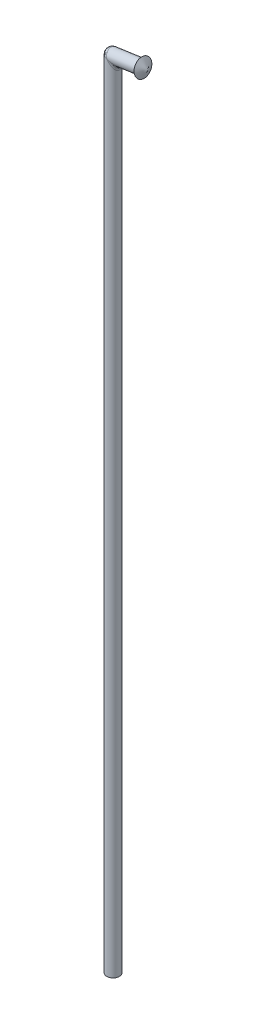
ISO-10303-21;
HEADER;
FILE_DESCRIPTION(('STEP AP214'),'2;1');
FILE_NAME('part.step','',(''),(''),'','','');
FILE_SCHEMA(('AUTOMOTIVE_DESIGN { 1 0 10303 214 1 1 1 1 }'));
ENDSEC;
DATA;
#1=APPLICATION_CONTEXT('core data for automotive mechanical design processes');
#2=APPLICATION_PROTOCOL_DEFINITION('international standard','automotive_design',2000,#1);
#3=PRODUCT_CONTEXT('',#1,'mechanical');
#4=PRODUCT('Part','Part','',(#3));
#5=PRODUCT_RELATED_PRODUCT_CATEGORY('part','',(#4));
#6=PRODUCT_DEFINITION_FORMATION('','',#4);
#7=PRODUCT_DEFINITION_CONTEXT('part definition',#1,'design');
#8=PRODUCT_DEFINITION('design','',#6,#7);
#9=PRODUCT_DEFINITION_SHAPE('','',#8);
#10=(LENGTH_UNIT() NAMED_UNIT(*) SI_UNIT(.MILLI.,.METRE.));
#11=(NAMED_UNIT(*) PLANE_ANGLE_UNIT() SI_UNIT($,.RADIAN.));
#12=(NAMED_UNIT(*) SI_UNIT($,.STERADIAN.) SOLID_ANGLE_UNIT());
#13=UNCERTAINTY_MEASURE_WITH_UNIT(LENGTH_MEASURE(1.E-05),#10,'distance_accuracy_value','');
#14=(GEOMETRIC_REPRESENTATION_CONTEXT(3) GLOBAL_UNCERTAINTY_ASSIGNED_CONTEXT((#13)) GLOBAL_UNIT_ASSIGNED_CONTEXT((#10,
#11,#12)) REPRESENTATION_CONTEXT('',''));
#15=CARTESIAN_POINT('',(0.,0.,0.));
#16=DIRECTION('',(0.,0.,1.));
#17=DIRECTION('',(1.,0.,0.));
#18=AXIS2_PLACEMENT_3D('',#15,#16,#17);
#19=CARTESIAN_POINT('',(0.,0.,0.));
#20=DIRECTION('',(0.,1.,0.));
#21=DIRECTION('',(0.,0.,1.));
#22=AXIS2_PLACEMENT_3D('',#19,#20,#21);
#23=PLANE('',#22);
#24=CARTESIAN_POINT('',(0.,0.,0.));
#25=DIRECTION('',(0.,1.,0.));
#26=DIRECTION('',(0.,0.,1.));
#27=AXIS2_PLACEMENT_3D('',#24,#25,#26);
#28=CIRCLE('',#27,1.25);
#29=CARTESIAN_POINT('',(0.,0.,1.25));
#30=VERTEX_POINT('',#29);
#31=EDGE_CURVE('E89',#30,#30,#28,.T.);
#32=ORIENTED_EDGE('',*,*,#31,.F.);
#33=EDGE_LOOP('',(#32));
#34=FACE_BOUND('',#33,.T.);
#35=ADVANCED_FACE('F46',(#34),#23,.F.);
#36=CARTESIAN_POINT('',(-2.46200161876884,157.650043674398,0.));
#37=DIRECTION('',(0.990048234541686,0.140728438067404,0.));
#38=DIRECTION('',(-0.140728438067404,0.990048234541686,0.));
#39=AXIS2_PLACEMENT_3D('',#36,#37,#38);
#40=CYLINDRICAL_SURFACE('',#39,1.25);
#41=CARTESIAN_POINT('',(0.,158.,0.));
#42=DIRECTION('',(-0.415227467097706,-0.909717621335117,0.));
#43=DIRECTION('',(-0.909717621335117,0.415227467097706,0.));
#44=AXIS2_PLACEMENT_3D('',#41,#42,#43);
#45=ELLIPSE('',#44,2.31860031339944,1.25);
#46=CARTESIAN_POINT('',(0.,158.,1.25));
#47=VERTEX_POINT('',#46);
#48=CARTESIAN_POINT('',(0.,158.,-1.25));
#49=VERTEX_POINT('',#48);
#50=EDGE_CURVE('E59',#47,#49,#45,.F.);
#51=ORIENTED_EDGE('',*,*,#50,.T.);
#52=CARTESIAN_POINT('',(0.,158.,0.));
#53=DIRECTION('',(-0.951393670650659,-0.307977407362724,0.));
#54=DIRECTION('',(-0.307977407362724,0.951393670650659,0.));
#55=AXIS2_PLACEMENT_3D('',#52,#53,#54);
#56=ELLIPSE('',#55,1.2686918868929,1.25);
#57=EDGE_CURVE('E13',#49,#47,#56,.F.);
#58=ORIENTED_EDGE('',*,*,#57,.T.);
#59=EDGE_LOOP('',(#51,#58));
#60=FACE_BOUND('',#59,.T.);
#61=CARTESIAN_POINT('',(5.94028940725011,158.844370628404,0.));
#62=DIRECTION('',(0.990048234541686,0.140728438067404,0.));
#63=DIRECTION('',(0.,0.,1.));
#64=AXIS2_PLACEMENT_3D('',#61,#62,#63);
#65=CIRCLE('',#64,1.25);
#66=CARTESIAN_POINT('',(5.94028940725011,158.844370628404,1.25));
#67=VERTEX_POINT('',#66);
#68=EDGE_CURVE('E86',#67,#67,#65,.T.);
#69=ORIENTED_EDGE('',*,*,#68,.F.);
#70=EDGE_LOOP('',(#69));
#71=FACE_BOUND('',#70,.T.);
#72=ADVANCED_FACE('F107',(#60,#71),#40,.T.);
#73=CARTESIAN_POINT('',(0.,0.,0.));
#74=DIRECTION('',(0.,1.,0.));
#75=DIRECTION('',(0.,0.,1.));
#76=AXIS2_PLACEMENT_3D('',#73,#74,#75);
#77=CYLINDRICAL_SURFACE('',#76,1.25);
#78=ORIENTED_EDGE('',*,*,#31,.T.);
#79=EDGE_LOOP('',(#78));
#80=FACE_BOUND('',#79,.T.);
#81=CARTESIAN_POINT('',(0.,158.,0.));
#82=DIRECTION('',(-0.171024343180322,-0.985266803480021,0.));
#83=DIRECTION('',(-0.985266803480021,0.171024343180322,0.));
#84=AXIS2_PLACEMENT_3D('',#81,#82,#83);
#85=ELLIPSE('',#84,1.2686918868929,1.25);
#86=EDGE_CURVE('E93',#47,#49,#85,.T.);
#87=ORIENTED_EDGE('',*,*,#86,.T.);
#88=CARTESIAN_POINT('',(0.,158.,0.));
#89=DIRECTION('',(-0.842230012046951,-0.539118360666183,0.));
#90=DIRECTION('',(-0.539118360666183,0.842230012046951,0.));
#91=AXIS2_PLACEMENT_3D('',#88,#89,#90);
#92=ELLIPSE('',#91,2.31860031339943,1.25);
#93=EDGE_CURVE('E97',#49,#47,#92,.T.);
#94=ORIENTED_EDGE('',*,*,#93,.T.);
#95=EDGE_LOOP('',(#87,#94));
#96=FACE_BOUND('',#95,.T.);
#97=ADVANCED_FACE('F80',(#80,#96),#77,.T.);
#98=CARTESIAN_POINT('',(5.94028940725012,158.844370628404,0.));
#99=DIRECTION('',(-0.990048234541686,-0.140728438067404,0.));
#100=DIRECTION('',(-0.140728438067404,0.990048234541686,0.));
#101=AXIS2_PLACEMENT_3D('',#98,#99,#100);
#102=CONICAL_SURFACE('',#101,1.75000000000001,1.11701072127637);
#103=CARTESIAN_POINT('',(6.78532728666676,158.964486857826,0.));
#104=VERTEX_POINT('',#103);
#105=VERTEX_LOOP('',#104);
#106=FACE_BOUND('',#105,.T.);
#107=CARTESIAN_POINT('',(5.94028940725012,158.844370628404,0.));
#108=DIRECTION('',(0.990048234541686,0.140728438067404,0.));
#109=DIRECTION('',(-0.140728438067404,0.990048234541686,0.));
#110=AXIS2_PLACEMENT_3D('',#107,#108,#109);
#111=CIRCLE('',#110,1.75000000000001);
#112=CARTESIAN_POINT('',(5.69401464063216,160.576955038852,0.));
#113=VERTEX_POINT('',#112);
#114=EDGE_CURVE('E84',#113,#113,#111,.T.);
#115=ORIENTED_EDGE('',*,*,#114,.T.);
#116=EDGE_LOOP('',(#115));
#117=FACE_BOUND('',#116,.T.);
#118=ADVANCED_FACE('F76',(#106,#117),#102,.T.);
#119=CARTESIAN_POINT('',(5.94028940725012,158.844370628404,0.));
#120=DIRECTION('',(0.990048234541686,0.140728438067404,0.));
#121=DIRECTION('',(-0.140728438067404,0.990048234541686,0.));
#122=AXIS2_PLACEMENT_3D('',#119,#120,#121);
#123=PLANE('',#122);
#124=ORIENTED_EDGE('',*,*,#68,.T.);
#125=EDGE_LOOP('',(#124));
#126=FACE_BOUND('',#125,.T.);
#127=ORIENTED_EDGE('',*,*,#114,.F.);
#128=EDGE_LOOP('',(#127));
#129=FACE_BOUND('',#128,.T.);
#130=ADVANCED_FACE('F79',(#126,#129),#123,.F.);
#131=CARTESIAN_POINT('',(0.,158.,1.25));
#132=CARTESIAN_POINT('',(0.,158.,1.25));
#133=CARTESIAN_POINT('',(0.,158.,1.25));
#134=CARTESIAN_POINT('',(0.0919090780486481,157.958049428981,1.24998466260043));
#135=CARTESIAN_POINT('',(0.0732103912828929,157.936460058134,1.25012947653364));
#136=CARTESIAN_POINT('',(0.0544673097737803,157.914909217875,1.24998466260043));
#137=CARTESIAN_POINT('',(0.18384034216575,157.916088731451,1.24643859237733));
#138=CARTESIAN_POINT('',(0.146578309183977,157.872783397532,1.24398902870987));
#139=CARTESIAN_POINT('',(0.108947767492126,157.829797895561,1.24643859237732));
#140=CARTESIAN_POINT('',(0.366122526857958,157.832888661372,1.23222560778185));
#141=CARTESIAN_POINT('',(0.290621167785291,157.747767334902,1.22003105610716));
#142=CARTESIAN_POINT('',(0.216972137126396,157.661038356327,1.23222560778185));
#143=CARTESIAN_POINT('',(0.456480084233948,157.791646259552,1.22161084378618));
#144=CARTESIAN_POINT('',(0.361651202370123,157.686119743773,1.20218398658378));
#145=CARTESIAN_POINT('',(0.270519982154233,157.57738399496,1.22161084378618));
#146=CARTESIAN_POINT('',(0.634075243492491,157.710585514527,1.19340762522205));
#147=CARTESIAN_POINT('',(0.498712964638946,157.56716263599,1.15549659329999));
#148=CARTESIAN_POINT('',(0.375766719027591,157.412963773108,1.19340762522205));
#149=CARTESIAN_POINT('',(0.721339013126855,157.67075522743,1.17592147104714));
#150=CARTESIAN_POINT('',(0.56509167791778,157.509551967491,1.12659905960002));
#151=CARTESIAN_POINT('',(0.427481118449451,157.332173686133,1.17592147104714));
#152=CARTESIAN_POINT('',(0.891227594801344,157.593212038419,1.13421919213761));
#153=CARTESIAN_POINT('',(0.690692005869755,157.40054233926,1.05927281246361));
#154=CARTESIAN_POINT('',(0.528160770574727,157.17488832765,1.1342191921376));
#155=CARTESIAN_POINT('',(0.973911310051928,157.555472250986,1.1101518668742));
#156=CARTESIAN_POINT('',(0.750242294770595,157.348858120278,1.02076172267759));
#157=CARTESIAN_POINT('',(0.577160930596101,157.098338522679,1.1101518668742));
#158=CARTESIAN_POINT('',(1.13319102705518,157.482771325006,1.05565384916028));
#159=CARTESIAN_POINT('',(0.860260578706606,157.253372284961,0.936260478329249));
#160=CARTESIAN_POINT('',(0.671553539801737,156.950875007821,1.05565384916027));
#161=CARTESIAN_POINT('',(1.2098909115074,157.447762770702,1.02541153193446));
#162=CARTESIAN_POINT('',(0.911029021123789,157.209309907704,0.890169574167184));
#163=CARTESIAN_POINT('',(0.717007552123144,156.879865121796,1.02541153193446));
#164=CARTESIAN_POINT('',(1.35584272610455,157.38114517325,0.959041682376993));
#165=CARTESIAN_POINT('',(1.00197382996496,157.130378109014,0.793258137981303));
#166=CARTESIAN_POINT('',(0.803501757771693,156.744740775863,0.959041682376991));
#167=CARTESIAN_POINT('',(1.4252537537771,157.349463512333,0.923131320056256));
#168=CARTESIAN_POINT('',(1.04241045588986,157.095282806073,0.742330277428939));
#169=CARTESIAN_POINT('',(0.844636235738668,156.680479021114,0.923131320056252));
#170=CARTESIAN_POINT('',(1.55538246437086,157.290068142133,0.84601304395963));
#171=CARTESIAN_POINT('',(1.11185924589663,157.035007591006,0.639134029290798));
#172=CARTESIAN_POINT('',(0.921753327334579,156.560003938604,0.846013043959629));
#173=CARTESIAN_POINT('',(1.61631975028436,157.262254198236,0.80503527866337));
#174=CARTESIAN_POINT('',(1.14108042925682,157.009646269212,0.586769835645948));
#175=CARTESIAN_POINT('',(0.957866082451842,156.503587299149,0.805035278663372));
#176=CARTESIAN_POINT('',(1.72839589498728,157.211098660962,0.718474476155359));
#177=CARTESIAN_POINT('',(1.1882840766356,156.968677808892,0.484492894127739));
#178=CARTESIAN_POINT('',(1.02428483260571,156.399825548811,0.718474476155361));
#179=CARTESIAN_POINT('',(1.77981086469031,157.187631040747,0.673113630430566));
#180=CARTESIAN_POINT('',(1.20641767160657,156.952939502484,0.434518721300821));
#181=CARTESIAN_POINT('',(1.05475445694838,156.352224810365,0.673113630430563));
#182=CARTESIAN_POINT('',(1.87190658202428,157.145595280922,0.578578095945349));
#183=CARTESIAN_POINT('',(1.23297256968229,156.929892273116,0.340616797956378));
#184=CARTESIAN_POINT('',(1.10933237320398,156.266961234833,0.578578095945345));
#185=CARTESIAN_POINT('',(1.91290119196647,157.126883883394,0.52959358558752));
#186=CARTESIAN_POINT('',(1.24148875542777,156.922501000679,0.296684241258395));
#187=CARTESIAN_POINT('',(1.13362666671865,156.229007819382,0.529593585587519));
#188=CARTESIAN_POINT('',(1.98342250815793,157.094695447321,0.428691664342946));
#189=CARTESIAN_POINT('',(1.25173810857215,156.913605497028,0.217230299884882));
#190=CARTESIAN_POINT('',(1.17541912570319,156.163718143122,0.428691664342948));
#191=CARTESIAN_POINT('',(2.01326327466657,157.081075060508,0.376910881159835));
#192=CARTESIAN_POINT('',(1.25352099583863,156.912058113504,0.181773494754135));
#193=CARTESIAN_POINT('',(1.19310341008316,156.136091120685,0.376910881159836));
#194=CARTESIAN_POINT('',(2.06097961191989,157.059295627646,0.271368448094559));
#195=CARTESIAN_POINT('',(1.25408866179972,156.911565431228,0.119190192634685));
#196=CARTESIAN_POINT('',(1.22138114474906,156.091914630797,0.271368448094558));
#197=CARTESIAN_POINT('',(2.07911535294046,157.051017830634,0.217680062106324));
#198=CARTESIAN_POINT('',(1.25289449203957,156.912601861656,0.0921935122387316));
#199=CARTESIAN_POINT('',(1.23212877757398,156.075124293862,0.217680062106323));
#200=CARTESIAN_POINT('',(2.10318680886143,157.040030762298,0.109314030757024));
#201=CARTESIAN_POINT('',(1.25084675363765,156.914379111808,0.0433799023138032));
#202=CARTESIAN_POINT('',(1.24639404357588,156.05283858439,0.109314030757024));
#203=CARTESIAN_POINT('',(2.1092715619326,157.037253464655,0.0546570153785123));
#204=CARTESIAN_POINT('',(1.25,156.91511401673,0.0217374409078353));
#205=CARTESIAN_POINT('',(1.25,156.047205230114,0.0546570153785119));
#206=CARTESIAN_POINT('',(2.1092715619326,157.037253464655,-0.054657015378512));
#207=CARTESIAN_POINT('',(1.25,156.91511401673,-0.0217374409078352));
#208=CARTESIAN_POINT('',(1.25,156.047205230114,-0.0546570153785117));
#209=CARTESIAN_POINT('',(2.10318680886143,157.040030762298,-0.109314030757024));
#210=CARTESIAN_POINT('',(1.25084675363765,156.914379111808,-0.0433799023138029));
#211=CARTESIAN_POINT('',(1.24639404357588,156.05283858439,-0.109314030757023));
#212=CARTESIAN_POINT('',(2.07911535294046,157.051017830634,-0.217680062106324));
#213=CARTESIAN_POINT('',(1.25289449203957,156.912601861656,-0.0921935122387315));
#214=CARTESIAN_POINT('',(1.23212877757398,156.075124293862,-0.217680062106323));
#215=CARTESIAN_POINT('',(2.06097961191989,157.059295627646,-0.271368448094559));
#216=CARTESIAN_POINT('',(1.25408866179972,156.911565431228,-0.119190192634685));
#217=CARTESIAN_POINT('',(1.22138114474906,156.091914630797,-0.271368448094558));
#218=CARTESIAN_POINT('',(2.01326327466657,157.081075060508,-0.376910881159835));
#219=CARTESIAN_POINT('',(1.25352099583863,156.912058113504,-0.181773494754135));
#220=CARTESIAN_POINT('',(1.19310341008316,156.136091120685,-0.376910881159836));
#221=CARTESIAN_POINT('',(1.98342250815793,157.094695447321,-0.428691664342946));
#222=CARTESIAN_POINT('',(1.25173810857215,156.913605497028,-0.217230299884882));
#223=CARTESIAN_POINT('',(1.17541912570319,156.163718143122,-0.428691664342948));
#224=CARTESIAN_POINT('',(1.91290119196647,157.126883883394,-0.529593585587519));
#225=CARTESIAN_POINT('',(1.24148875542777,156.922501000679,-0.296684241258394));
#226=CARTESIAN_POINT('',(1.13362666671865,156.229007819382,-0.529593585587519));
#227=CARTESIAN_POINT('',(1.87190658202428,157.145595280922,-0.578578095945349));
#228=CARTESIAN_POINT('',(1.23297256968229,156.929892273116,-0.340616797956378));
#229=CARTESIAN_POINT('',(1.10933237320398,156.266961234833,-0.578578095945344));
#230=CARTESIAN_POINT('',(1.77981086469031,157.187631040747,-0.673113630430566));
#231=CARTESIAN_POINT('',(1.20641767160657,156.952939502484,-0.434518721300821));
#232=CARTESIAN_POINT('',(1.05475445694838,156.352224810365,-0.673113630430562));
#233=CARTESIAN_POINT('',(1.72839589498728,157.211098660962,-0.718474476155359));
#234=CARTESIAN_POINT('',(1.1882840766356,156.968677808892,-0.484492894127739));
#235=CARTESIAN_POINT('',(1.02428483260571,156.399825548811,-0.71847447615536));
#236=CARTESIAN_POINT('',(1.61631975028436,157.262254198236,-0.805035278663369));
#237=CARTESIAN_POINT('',(1.14108042925682,157.009646269212,-0.586769835645948));
#238=CARTESIAN_POINT('',(0.957866082451842,156.503587299149,-0.805035278663372));
#239=CARTESIAN_POINT('',(1.55538246437086,157.290068142133,-0.84601304395963));
#240=CARTESIAN_POINT('',(1.11185924589663,157.035007591006,-0.639134029290798));
#241=CARTESIAN_POINT('',(0.921753327334579,156.560003938604,-0.846013043959628));
#242=CARTESIAN_POINT('',(1.4252537537771,157.349463512333,-0.923131320056256));
#243=CARTESIAN_POINT('',(1.04241045588986,157.095282806073,-0.742330277428938));
#244=CARTESIAN_POINT('',(0.844636235738669,156.680479021114,-0.923131320056252));
#245=CARTESIAN_POINT('',(1.35584272610455,157.38114517325,-0.959041682376992));
#246=CARTESIAN_POINT('',(1.00197382996496,157.130378109014,-0.793258137981302));
#247=CARTESIAN_POINT('',(0.803501757771693,156.744740775863,-0.959041682376991));
#248=CARTESIAN_POINT('',(1.2098909115074,157.447762770702,-1.02541153193446));
#249=CARTESIAN_POINT('',(0.91102902112379,157.209309907704,-0.890169574167183));
#250=CARTESIAN_POINT('',(0.717007552123145,156.879865121796,-1.02541153193446));
#251=CARTESIAN_POINT('',(1.13319102705518,157.482771325006,-1.05565384916028));
#252=CARTESIAN_POINT('',(0.860260578706607,157.253372284961,-0.936260478329248));
#253=CARTESIAN_POINT('',(0.671553539801737,156.950875007821,-1.05565384916027));
#254=CARTESIAN_POINT('',(0.973911310051929,157.555472250986,-1.1101518668742));
#255=CARTESIAN_POINT('',(0.750242294770596,157.348858120278,-1.02076172267759));
#256=CARTESIAN_POINT('',(0.577160930596102,157.098338522679,-1.1101518668742));
#257=CARTESIAN_POINT('',(0.891227594801344,157.593212038419,-1.13421919213761));
#258=CARTESIAN_POINT('',(0.690692005869755,157.40054233926,-1.05927281246361));
#259=CARTESIAN_POINT('',(0.528160770574727,157.17488832765,-1.1342191921376));
#260=CARTESIAN_POINT('',(0.721339013126855,157.67075522743,-1.17592147104714));
#261=CARTESIAN_POINT('',(0.56509167791778,157.509551967491,-1.12659905960002));
#262=CARTESIAN_POINT('',(0.427481118449451,157.332173686133,-1.17592147104714));
#263=CARTESIAN_POINT('',(0.634075243492491,157.710585514527,-1.19340762522205));
#264=CARTESIAN_POINT('',(0.498712964638946,157.56716263599,-1.15549659329999));
#265=CARTESIAN_POINT('',(0.375766719027591,157.412963773108,-1.19340762522205));
#266=CARTESIAN_POINT('',(0.456480084233949,157.791646259552,-1.22161084378618));
#267=CARTESIAN_POINT('',(0.361651202370123,157.686119743773,-1.20218398658378));
#268=CARTESIAN_POINT('',(0.270519982154233,157.57738399496,-1.22161084378618));
#269=CARTESIAN_POINT('',(0.366122526857958,157.832888661372,-1.23222560778185));
#270=CARTESIAN_POINT('',(0.290621167785291,157.747767334902,-1.22003105610716));
#271=CARTESIAN_POINT('',(0.216972137126396,157.661038356327,-1.23222560778185));
#272=CARTESIAN_POINT('',(0.183840342165751,157.916088731451,-1.24643859237733));
#273=CARTESIAN_POINT('',(0.146578309183977,157.872783397532,-1.24398902870987));
#274=CARTESIAN_POINT('',(0.108947767492126,157.829797895561,-1.24643859237732));
#275=CARTESIAN_POINT('',(0.0919090780486486,157.958049428981,-1.24998466260043));
#276=CARTESIAN_POINT('',(0.0732103912828931,157.936460058134,-1.25012947653364));
#277=CARTESIAN_POINT('',(0.0544673097737804,157.914909217875,-1.24998466260043));
#278=CARTESIAN_POINT('',(0.,158.,-1.25));
#279=CARTESIAN_POINT('',(0.,158.,-1.25));
#280=CARTESIAN_POINT('',(0.,158.,-1.25));
#281=(BOUNDED_SURFACE() B_SPLINE_SURFACE(3,2,((#131,#132,#133),(#134,#135,#136),(#137,#138,
#139),(#140,#141,#142),(#143,#144,#145),(#146,#147,#148),(#149,#150,#151),(#152,#153,#154),
(#155,#156,#157),(#158,#159,#160),(#161,#162,#163),(#164,#165,#166),(#167,#168,#169),(#170,#171,
#172),(#173,#174,#175),(#176,#177,#178),(#179,#180,#181),(#182,#183,#184),(#185,#186,#187),
(#188,#189,#190),(#191,#192,#193),(#194,#195,#196),(#197,#198,#199),(#200,#201,#202),(#203,#204,
#205),(#206,#207,#208),(#209,#210,#211),(#212,#213,#214),(#215,#216,#217),(#218,#219,#220),
(#221,#222,#223),(#224,#225,#226),(#227,#228,#229),(#230,#231,#232),(#233,#234,#235),(#236,#237,
#238),(#239,#240,#241),(#242,#243,#244),(#245,#246,#247),(#248,#249,#250),(#251,#252,#253),
(#254,#255,#256),(#257,#258,#259),(#260,#261,#262),(#263,#264,#265),(#266,#267,#268),(#269,#270,
#271),(#272,#273,#274),(#275,#276,#277),(#278,#279,#280)),.UNSPECIFIED.,.F.,.F.,
.F.) B_SPLINE_SURFACE_WITH_KNOTS((4,2,2,2,2,2,2,2,2,2,2,2,2,2,2,2,2,2,2,2,2,2,2,2,4),(3,3),(0.,
0.389345774223594,0.775850450961828,1.15680654915077,1.52977488554308,1.89272083138568,
2.24415122853741,2.58324810445326,2.9099899837625,3.22524327136925,3.53079599439878,
3.82929917722534,4.12408703890276,4.41887490058017,4.71737808340673,5.02293080643626,
5.33818409404302,5.66492597335225,6.0040228492681,6.35545324641983,6.71839919226243,
7.09136752865475,7.47232362684369,7.85882830358192,8.24817407780552),(0.,1.),
.UNSPECIFIED.) GEOMETRIC_REPRESENTATION_ITEM() RATIONAL_B_SPLINE_SURFACE(((1.,1.,1.),(1.,
1.00000861503001,1.),(1.,0.998776646528902,1.),(1.,0.993907996028786,1.),(1.,0.990288927079258,
1.),(1.,0.980789502973003,1.),(1.,0.974942356206723,1.),(1.,0.961261778087285,1.),(1.,
0.953472565152365,1.),(1.,0.936302022744637,1.),(1.,0.926969101173609,1.),(1.,0.907231363763816,
1.),(1.,0.896869952119778,1.),(1.,0.875717888740568,1.),(1.,0.864955063147683,1.),(1.,
0.843751177665596,1.),(1.,0.833312681995879,1.),(1.,0.813580037222901,1.),(1.,0.804258556793914,
1.),(1.,0.787583509308971,1.),(1.,0.780178214092969,1.),(1.,0.768051624205414,1.),(1.,
0.763272347559414,1.),(1.,0.756878165421782,1.),(1.,0.75522461495485,1.),(1.,0.755224614954849,
1.),(1.,0.756878165421782,1.),(1.,0.763272347559414,1.),(1.,0.768051624205414,1.),(1.,
0.780178214092969,1.),(1.,0.787583509308971,1.),(1.,0.804258556793914,1.),(1.,0.813580037222901,
1.),(1.,0.833312681995879,1.),(1.,0.843751177665597,1.),(1.,0.864955063147683,1.),(1.,
0.875717888740568,1.),(1.,0.896869952119778,1.),(1.,0.907231363763816,1.),(1.,0.926969101173608,
1.),(1.,0.936302022744637,1.),(1.,0.953472565152365,1.),(1.,0.961261778087285,1.),(1.,
0.974942356206723,1.),(1.,0.980789502973003,1.),(1.,0.990288927079258,1.),(1.,0.993907996028786,
1.),(1.,0.998776646528902,1.),(1.,1.00000861503001,1.),(1.,1.,1.))) REPRESENTATION_ITEM('') SURFACE());
#282=ORIENTED_EDGE('',*,*,#93,.F.);
#283=ORIENTED_EDGE('',*,*,#50,.F.);
#284=EDGE_LOOP('',(#282,#283));
#285=FACE_BOUND('',#284,.T.);
#286=ADVANCED_FACE('F101',(#285),#281,.F.);
#287=CARTESIAN_POINT('',(0.,158.,-1.25));
#288=CARTESIAN_POINT('',(0.,158.,-1.25));
#289=CARTESIAN_POINT('',(0.,158.,-1.25));
#290=CARTESIAN_POINT('',(-0.0544673097737964,158.009454531347,-1.24998466260043));
#291=CARTESIAN_POINT('',(-0.0357496435824633,158.031027429784,-1.2499510361591));
#292=CARTESIAN_POINT('',(-0.0170255414989214,158.052594742453,-1.24998466260043));
#293=CARTESIAN_POINT('',(-0.10894776749214,158.018911344938,-1.24643859237732));
#294=CARTESIAN_POINT('',(-0.0715897839505807,158.062133402523,-1.24888288418948));
#295=CARTESIAN_POINT('',(-0.0340551928185098,158.105202180828,-1.24643859237732));
#296=CARTESIAN_POINT('',(-0.216972137126406,158.037662404853,-1.23222560778185));
#297=CARTESIAN_POINT('',(-0.143578430620892,158.124612981504,-1.24435605123549));
#298=CARTESIAN_POINT('',(-0.0678217473948414,158.209512709898,-1.23222560778185));
#299=CARTESIAN_POINT('',(-0.27051998215424,158.046957333893,-1.22161084378618));
#300=CARTESIAN_POINT('',(-0.179900376061358,158.156137117099,-1.24089223610703));
#301=CARTESIAN_POINT('',(-0.084559880074524,158.261219598486,-1.22161084378617));
#302=CARTESIAN_POINT('',(-0.375766719027591,158.065226247432,-1.19340762522205));
#303=CARTESIAN_POINT('',(-0.253323315936493,158.219861531756,-1.23119223542759));
#304=CARTESIAN_POINT('',(-0.1174581945627,158.362847988851,-1.19340762522202));
#305=CARTESIAN_POINT('',(-0.427481118449446,158.074202923763,-1.17592147104714));
#306=CARTESIAN_POINT('',(-0.290593584255541,158.25220872511,-1.22494650946865));
#307=CARTESIAN_POINT('',(-0.133623223772058,158.41278446506,-1.17592147104711));
#308=CARTESIAN_POINT('',(-0.528160770574727,158.091679074706,-1.1342191921376));
#309=CARTESIAN_POINT('',(-0.366329277236156,158.317940398508,-1.2088736386502));
#310=CARTESIAN_POINT('',(-0.165093946348118,158.510002785475,-1.13421919213758));
#311=CARTESIAN_POINT('',(-0.577160930596111,158.100184608591,-1.11015186687419));
#312=CARTESIAN_POINT('',(-0.404954218017865,158.351463323995,-1.19903599279379));
#313=CARTESIAN_POINT('',(-0.18041055114028,158.557318336898,-1.11015186687419));
#314=CARTESIAN_POINT('',(-0.671553539801752,158.116569443575,-1.05565384916027));
#315=CARTESIAN_POINT('',(-0.483687204836089,158.419796375051,-1.17456286033348));
#316=CARTESIAN_POINT('',(-0.209916052548299,158.64846576076,-1.05565384916028));
#317=CARTESIAN_POINT('',(-0.717007552123155,158.124459430912,-1.02541153193445));
#318=CARTESIAN_POINT('',(-0.523938461455344,158.454730794343,-1.15992186606912));
#319=CARTESIAN_POINT('',(-0.224124192738893,158.692357079818,-1.02541153193446));
#320=CARTESIAN_POINT('',(-0.803501757771695,158.139473247126,-0.95904168237699));
#321=CARTESIAN_POINT('',(-0.605938897224725,158.525899693054,-1.12412838229473));
#322=CARTESIAN_POINT('',(-0.251160789438843,158.775877644513,-0.959041682376978));
#323=CARTESIAN_POINT('',(-0.844636235738666,158.146613442098,-0.923131320056257));
#324=CARTESIAN_POINT('',(-0.647805469358684,158.562236058874,-1.10298682538237));
#325=CARTESIAN_POINT('',(-0.264018717700245,158.815597933317,-0.923131320056228));
#326=CARTESIAN_POINT('',(-0.921753327334578,158.159999562377,-0.846013043959627));
#327=CARTESIAN_POINT('',(-0.732544491766811,158.635781800992,-1.05199700650221));
#328=CARTESIAN_POINT('',(-0.288124190298302,158.890063765906,-0.846013043959597));
#329=CARTESIAN_POINT('',(-0.957866082451848,158.166268077872,-0.805035278663361));
#330=CARTESIAN_POINT('',(-0.77549672532568,158.673060421902,-1.02219573560903));
#331=CARTESIAN_POINT('',(-0.299412414619326,158.924934976959,-0.805035278663346));
#332=CARTESIAN_POINT('',(-1.02428483260571,158.177797161243,-0.718474476155355));
#333=CARTESIAN_POINT('',(-0.861089089195483,158.747346786572,-0.951412589438673));
#334=CARTESIAN_POINT('',(-0.320173770224133,158.989070273395,-0.718474476155334));
#335=CARTESIAN_POINT('',(-1.05475445694838,158.183086132182,-0.673113630430569));
#336=CARTESIAN_POINT('',(-0.903759493806166,158.784380805662,-0.910544633131086));
#337=CARTESIAN_POINT('',(-0.329698049206464,159.018492362563,-0.673113630430529));
#338=CARTESIAN_POINT('',(-1.10933237320398,158.192559862796,-0.578578095945348));
#339=CARTESIAN_POINT('',(-0.986331833006818,158.856046064386,-0.815437770861417));
#340=CARTESIAN_POINT('',(-0.346758164383682,159.071193908885,-0.578578095945313));
#341=CARTESIAN_POINT('',(-1.13362666671865,158.196776908958,-0.52959358558751));
#342=CARTESIAN_POINT('',(-1.02620821056284,158.890655122845,-0.761421833248838));
#343=CARTESIAN_POINT('',(-0.354352141470832,159.094652972969,-0.529593585587499));
#344=CARTESIAN_POINT('',(-1.17541912570319,158.204031317431,-0.428691664342939));
#345=CARTESIAN_POINT('',(-1.09953207842424,158.954293552031,-0.63912008868841));
#346=CARTESIAN_POINT('',(-0.367415743248451,159.13500862163,-0.428691664342934));
#347=CARTESIAN_POINT('',(-1.19310341008316,158.207100986591,-0.376910881159837));
#348=CARTESIAN_POINT('',(-1.13290638775358,158.983259408345,-0.571210970914306));
#349=CARTESIAN_POINT('',(-0.372943545499748,159.152084926413,-0.376910881159815));
#350=CARTESIAN_POINT('',(-1.22138114474905,158.212009485467,-0.271368448094563));
#351=CARTESIAN_POINT('',(-1.18889601106957,159.03185329438,-0.422730659614158));
#352=CARTESIAN_POINT('',(-0.381782677578221,159.179390482316,-0.271368448094538));
#353=CARTESIAN_POINT('',(-1.23212877757398,158.21387507846,-0.217680062106322));
#354=CARTESIAN_POINT('',(-1.21142033405182,159.051402352209,-0.34271409219957));
#355=CARTESIAN_POINT('',(-0.385142202207507,159.189768615232,-0.21768006210631));
#356=CARTESIAN_POINT('',(-1.24639404357588,158.216351268401,-0.109314030757019));
#357=CARTESIAN_POINT('',(-1.24200405728526,159.077946234331,-0.174789067991983));
#358=CARTESIAN_POINT('',(-0.389601278290339,159.20354344631,-0.10931403075702));
#359=CARTESIAN_POINT('',(-1.25,158.216977196654,-0.0546570153785097));
#360=CARTESIAN_POINT('',(-1.25,159.08488598327,-0.0875858827280573));
#361=CARTESIAN_POINT('',(-0.390728438067404,159.207025431196,-0.05465701537851));
#362=CARTESIAN_POINT('',(-1.25,158.216977196654,0.0546570153785097));
#363=CARTESIAN_POINT('',(-1.25,159.08488598327,0.0875858827280573));
#364=CARTESIAN_POINT('',(-0.390728438067404,159.207025431196,0.05465701537851));
#365=CARTESIAN_POINT('',(-1.24639404357588,158.216351268401,0.109314030757019));
#366=CARTESIAN_POINT('',(-1.24200405728526,159.077946234331,0.174789067991983));
#367=CARTESIAN_POINT('',(-0.389601278290339,159.20354344631,0.10931403075702));
#368=CARTESIAN_POINT('',(-1.23212877757398,158.21387507846,0.217680062106322));
#369=CARTESIAN_POINT('',(-1.21142033405182,159.051402352209,0.342714092199569));
#370=CARTESIAN_POINT('',(-0.385142202207507,159.189768615232,0.21768006210631));
#371=CARTESIAN_POINT('',(-1.22138114474905,158.212009485467,0.271368448094563));
#372=CARTESIAN_POINT('',(-1.18889601106957,159.03185329438,0.422730659614157));
#373=CARTESIAN_POINT('',(-0.381782677578221,159.179390482316,0.271368448094537));
#374=CARTESIAN_POINT('',(-1.19310341008316,158.207100986591,0.376910881159836));
#375=CARTESIAN_POINT('',(-1.13290638775358,158.983259408345,0.571210970914305));
#376=CARTESIAN_POINT('',(-0.372943545499749,159.152084926413,0.376910881159814));
#377=CARTESIAN_POINT('',(-1.17541912570319,158.204031317431,0.428691664342939));
#378=CARTESIAN_POINT('',(-1.09953207842424,158.954293552031,0.63912008868841));
#379=CARTESIAN_POINT('',(-0.367415743248451,159.13500862163,0.428691664342934));
#380=CARTESIAN_POINT('',(-1.13362666671865,158.196776908958,0.529593585587509));
#381=CARTESIAN_POINT('',(-1.02620821056284,158.890655122845,0.761421833248838));
#382=CARTESIAN_POINT('',(-0.354352141470832,159.094652972969,0.529593585587499));
#383=CARTESIAN_POINT('',(-1.10933237320398,158.192559862796,0.578578095945347));
#384=CARTESIAN_POINT('',(-0.986331833006818,158.856046064386,0.815437770861417));
#385=CARTESIAN_POINT('',(-0.346758164383682,159.071193908885,0.578578095945313));
#386=CARTESIAN_POINT('',(-1.05475445694838,158.183086132182,0.673113630430568));
#387=CARTESIAN_POINT('',(-0.903759493806166,158.784380805662,0.910544633131086));
#388=CARTESIAN_POINT('',(-0.329698049206464,159.018492362563,0.673113630430528));
#389=CARTESIAN_POINT('',(-1.02428483260571,158.177797161243,0.718474476155354));
#390=CARTESIAN_POINT('',(-0.861089089195483,158.747346786572,0.951412589438673));
#391=CARTESIAN_POINT('',(-0.320173770224133,158.989070273395,0.718474476155333));
#392=CARTESIAN_POINT('',(-0.957866082451849,158.166268077872,0.805035278663361));
#393=CARTESIAN_POINT('',(-0.775496725325681,158.673060421902,1.02219573560903));
#394=CARTESIAN_POINT('',(-0.299412414619326,158.924934976959,0.805035278663346));
#395=CARTESIAN_POINT('',(-0.921753327334578,158.159999562377,0.846013043959627));
#396=CARTESIAN_POINT('',(-0.732544491766812,158.635781800992,1.05199700650221));
#397=CARTESIAN_POINT('',(-0.288124190298302,158.890063765906,0.846013043959597));
#398=CARTESIAN_POINT('',(-0.844636235738666,158.146613442098,0.923131320056256));
#399=CARTESIAN_POINT('',(-0.647805469358684,158.562236058874,1.10298682538237));
#400=CARTESIAN_POINT('',(-0.264018717700246,158.815597933317,0.923131320056228));
#401=CARTESIAN_POINT('',(-0.803501757771696,158.139473247126,0.959041682376989));
#402=CARTESIAN_POINT('',(-0.605938897224726,158.525899693054,1.12412838229473));
#403=CARTESIAN_POINT('',(-0.251160789438843,158.775877644513,0.959041682376978));
#404=CARTESIAN_POINT('',(-0.717007552123156,158.124459430912,1.02541153193445));
#405=CARTESIAN_POINT('',(-0.523938461455344,158.454730794343,1.15992186606912));
#406=CARTESIAN_POINT('',(-0.224124192738893,158.692357079818,1.02541153193446));
#407=CARTESIAN_POINT('',(-0.671553539801752,158.116569443575,1.05565384916027));
#408=CARTESIAN_POINT('',(-0.483687204836089,158.419796375051,1.17456286033348));
#409=CARTESIAN_POINT('',(-0.209916052548299,158.64846576076,1.05565384916028));
#410=CARTESIAN_POINT('',(-0.577160930596111,158.100184608591,1.11015186687419));
#411=CARTESIAN_POINT('',(-0.404954218017865,158.351463323995,1.19903599279379));
#412=CARTESIAN_POINT('',(-0.18041055114028,158.557318336898,1.11015186687419));
#413=CARTESIAN_POINT('',(-0.528160770574728,158.091679074706,1.1342191921376));
#414=CARTESIAN_POINT('',(-0.366329277236156,158.317940398508,1.2088736386502));
#415=CARTESIAN_POINT('',(-0.165093946348119,158.510002785475,1.13421919213758));
#416=CARTESIAN_POINT('',(-0.427481118449447,158.074202923763,1.17592147104714));
#417=CARTESIAN_POINT('',(-0.290593584255541,158.25220872511,1.22494650946865));
#418=CARTESIAN_POINT('',(-0.133623223772058,158.41278446506,1.17592147104711));
#419=CARTESIAN_POINT('',(-0.375766719027592,158.065226247432,1.19340762522205));
#420=CARTESIAN_POINT('',(-0.253323315936494,158.219861531756,1.23119223542759));
#421=CARTESIAN_POINT('',(-0.1174581945627,158.362847988851,1.19340762522202));
#422=CARTESIAN_POINT('',(-0.270519982154241,158.046957333893,1.22161084378618));
#423=CARTESIAN_POINT('',(-0.179900376061358,158.156137117099,1.24089223610703));
#424=CARTESIAN_POINT('',(-0.0845598800745241,158.261219598486,1.22161084378617));
#425=CARTESIAN_POINT('',(-0.216972137126406,158.037662404853,1.23222560778185));
#426=CARTESIAN_POINT('',(-0.143578430620892,158.124612981504,1.24435605123549));
#427=CARTESIAN_POINT('',(-0.0678217473948415,158.209512709898,1.23222560778185));
#428=CARTESIAN_POINT('',(-0.108947767492141,158.018911344938,1.24643859237732));
#429=CARTESIAN_POINT('',(-0.071589783950581,158.062133402523,1.24888288418948));
#430=CARTESIAN_POINT('',(-0.03405519281851,158.105202180828,1.24643859237732));
#431=CARTESIAN_POINT('',(-0.0544673097737969,158.009454531347,1.24998466260043));
#432=CARTESIAN_POINT('',(-0.0357496435824637,158.031027429784,1.2499510361591));
#433=CARTESIAN_POINT('',(-0.0170255414989216,158.052594742453,1.24998466260043));
#434=CARTESIAN_POINT('',(0.,158.,1.25));
#435=CARTESIAN_POINT('',(0.,158.,1.25));
#436=CARTESIAN_POINT('',(0.,158.,1.25));
#437=(BOUNDED_SURFACE() B_SPLINE_SURFACE(3,2,((#287,#288,#289),(#290,#291,#292),(#293,#294,
#295),(#296,#297,#298),(#299,#300,#301),(#302,#303,#304),(#305,#306,#307),(#308,#309,#310),
(#311,#312,#313),(#314,#315,#316),(#317,#318,#319),(#320,#321,#322),(#323,#324,#325),(#326,#327,
#328),(#329,#330,#331),(#332,#333,#334),(#335,#336,#337),(#338,#339,#340),(#341,#342,#343),
(#344,#345,#346),(#347,#348,#349),(#350,#351,#352),(#353,#354,#355),(#356,#357,#358),(#359,#360,
#361),(#362,#363,#364),(#365,#366,#367),(#368,#369,#370),(#371,#372,#373),(#374,#375,#376),
(#377,#378,#379),(#380,#381,#382),(#383,#384,#385),(#386,#387,#388),(#389,#390,#391),(#392,#393,
#394),(#395,#396,#397),(#398,#399,#400),(#401,#402,#403),(#404,#405,#406),(#407,#408,#409),
(#410,#411,#412),(#413,#414,#415),(#416,#417,#418),(#419,#420,#421),(#422,#423,#424),(#425,#426,
#427),(#428,#429,#430),(#431,#432,#433),(#434,#435,#436)),.UNSPECIFIED.,.F.,.F.,
.F.) B_SPLINE_SURFACE_WITH_KNOTS((4,2,2,2,2,2,2,2,2,2,2,2,2,2,2,2,2,2,2,2,2,2,2,2,4),(3,3),(0.,
0.0432606415803973,0.0862056056624292,0.128534061016758,0.169974987282559,0.210302314598405,
0.24935013650416,0.287027567161474,0.323332220418061,0.358360363485472,0.392310666044313,
0.425477686358374,0.45823189321142,0.490986100064466,0.524153120378527,0.558103422937368,
0.59313156600478,0.629436219261366,0.66711364991868,0.706161471824435,0.746488799140281,
0.787929725406083,0.830258180760411,0.873203144842443,0.91646378642284),(0.,1.),
.UNSPECIFIED.) GEOMETRIC_REPRESENTATION_ITEM() RATIONAL_B_SPLINE_SURFACE(((1.,1.,1.),(1.,
1.00000861503001,1.),(1.,0.998776646528902,1.),(1.,0.993907996028785,1.),(1.,0.990288927079255,
1.),(1.,0.980789502972999,1.),(1.,0.974942356206719,1.),(1.,0.961261778087282,1.),(1.,
0.953472565152364,1.),(1.,0.936302022744636,1.),(1.,0.926969101173605,1.),(1.,0.907231363763812,
1.),(1.,0.896869952119775,1.),(1.,0.875717888740563,1.),(1.,0.864955063147676,1.),(1.,
0.843751177665591,1.),(1.,0.833312681995877,1.),(1.,0.813580037222902,1.),(1.,0.804258556793913,
1.),(1.,0.787583509308969,1.),(1.,0.780178214092967,1.),(1.,0.768051624205413,1.),(1.,
0.763272347559414,1.),(1.,0.756878165421783,1.),(1.,0.755224614954851,1.),(1.,0.755224614954851,
1.),(1.,0.756878165421783,1.),(1.,0.763272347559414,1.),(1.,0.768051624205413,1.),(1.,
0.780178214092967,1.),(1.,0.787583509308969,1.),(1.,0.804258556793913,1.),(1.,0.813580037222902,
1.),(1.,0.833312681995877,1.),(1.,0.843751177665591,1.),(1.,0.864955063147676,1.),(1.,
0.875717888740563,1.),(1.,0.896869952119775,1.),(1.,0.907231363763812,1.),(1.,0.926969101173605,
1.),(1.,0.936302022744636,1.),(1.,0.953472565152364,1.),(1.,0.961261778087282,1.),(1.,
0.974942356206719,1.),(1.,0.980789502972999,1.),(1.,0.990288927079255,1.),(1.,0.993907996028785,
1.),(1.,0.998776646528902,1.),(1.,1.00000861503001,1.),(1.,1.,1.))) REPRESENTATION_ITEM('') SURFACE());
#438=ORIENTED_EDGE('',*,*,#86,.F.);
#439=ORIENTED_EDGE('',*,*,#57,.F.);
#440=EDGE_LOOP('',(#438,#439));
#441=FACE_BOUND('',#440,.T.);
#442=ADVANCED_FACE('F48',(#441),#437,.T.);
#443=CLOSED_SHELL('',(#35,#72,#97,#118,#130,#286,#442));
#444=MANIFOLD_SOLID_BREP('B2',#443);
#445=ADVANCED_BREP_SHAPE_REPRESENTATION('',(#18,#444),#14);
#446=SHAPE_DEFINITION_REPRESENTATION(#9,#445);
ENDSEC;
END-ISO-10303-21;
